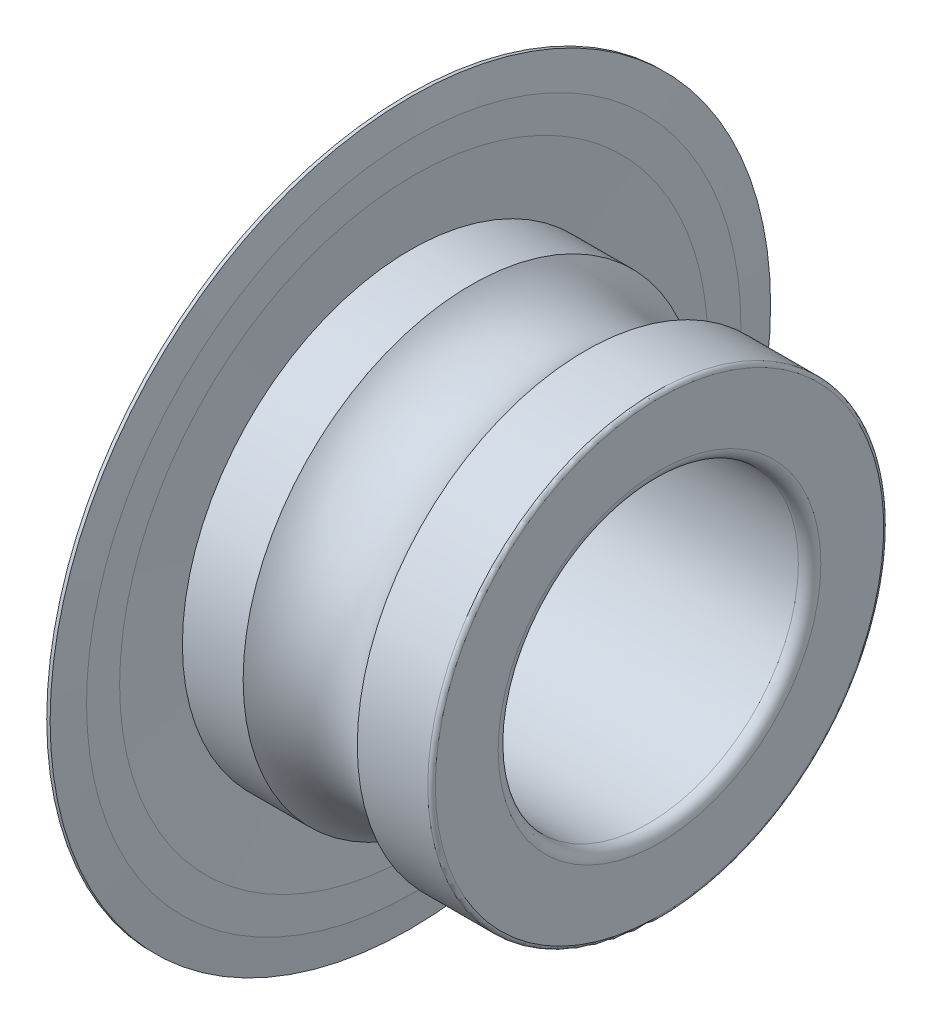
ISO-10303-21;
HEADER;
FILE_DESCRIPTION(('STEP AP214'),'2;1');
FILE_NAME('part.step','',(''),(''),'','','');
FILE_SCHEMA(('AUTOMOTIVE_DESIGN { 1 0 10303 214 1 1 1 1 }'));
ENDSEC;
DATA;
#1=APPLICATION_CONTEXT('core data for automotive mechanical design processes');
#2=APPLICATION_PROTOCOL_DEFINITION('international standard','automotive_design',2000,#1);
#3=PRODUCT_CONTEXT('',#1,'mechanical');
#4=PRODUCT('Part','Part','',(#3));
#5=PRODUCT_RELATED_PRODUCT_CATEGORY('part','',(#4));
#6=PRODUCT_DEFINITION_FORMATION('','',#4);
#7=PRODUCT_DEFINITION_CONTEXT('part definition',#1,'design');
#8=PRODUCT_DEFINITION('design','',#6,#7);
#9=PRODUCT_DEFINITION_SHAPE('','',#8);
#10=(LENGTH_UNIT() NAMED_UNIT(*) SI_UNIT(.MILLI.,.METRE.));
#11=(NAMED_UNIT(*) PLANE_ANGLE_UNIT() SI_UNIT($,.RADIAN.));
#12=(NAMED_UNIT(*) SI_UNIT($,.STERADIAN.) SOLID_ANGLE_UNIT());
#13=UNCERTAINTY_MEASURE_WITH_UNIT(LENGTH_MEASURE(1.E-05),#10,'distance_accuracy_value','');
#14=(GEOMETRIC_REPRESENTATION_CONTEXT(3) GLOBAL_UNCERTAINTY_ASSIGNED_CONTEXT((#13)) GLOBAL_UNIT_ASSIGNED_CONTEXT((#10,
#11,#12)) REPRESENTATION_CONTEXT('',''));
#15=CARTESIAN_POINT('',(0.,0.,0.));
#16=DIRECTION('',(0.,0.,1.));
#17=DIRECTION('',(1.,0.,0.));
#18=AXIS2_PLACEMENT_3D('',#15,#16,#17);
#19=CARTESIAN_POINT('',(50.,0.,0.));
#20=DIRECTION('',(-1.,0.,0.));
#21=DIRECTION('',(0.,0.,1.));
#22=AXIS2_PLACEMENT_3D('',#19,#20,#21);
#23=CYLINDRICAL_SURFACE('',#22,6.075);
#24=CARTESIAN_POINT('',(0.100000000000003,0.,0.));
#25=DIRECTION('',(-1.,0.,0.));
#26=DIRECTION('',(0.,0.,1.));
#27=AXIS2_PLACEMENT_3D('',#24,#25,#26);
#28=CIRCLE('',#27,6.075);
#29=CARTESIAN_POINT('',(0.100000000000003,0.,6.075));
#30=VERTEX_POINT('',#29);
#31=EDGE_CURVE('E76',#30,#30,#28,.T.);
#32=ORIENTED_EDGE('',*,*,#31,.F.);
#33=EDGE_LOOP('',(#32));
#34=FACE_BOUND('',#33,.T.);
#35=CARTESIAN_POINT('',(0.269999999999999,0.,0.));
#36=DIRECTION('',(1.,0.,0.));
#37=DIRECTION('',(0.,0.,-1.));
#38=AXIS2_PLACEMENT_3D('',#35,#36,#37);
#39=CIRCLE('',#38,6.075);
#40=CARTESIAN_POINT('',(0.269999999999999,0.,-6.075));
#41=VERTEX_POINT('',#40);
#42=EDGE_CURVE('E10',#41,#41,#39,.T.);
#43=ORIENTED_EDGE('',*,*,#42,.F.);
#44=EDGE_LOOP('',(#43));
#45=FACE_BOUND('',#44,.T.);
#46=ADVANCED_FACE('F35',(#34,#45),#23,.T.);
#47=CARTESIAN_POINT('',(1.979271473931,0.,0.));
#48=DIRECTION('',(-1.,0.,0.));
#49=DIRECTION('',(0.,0.,1.));
#50=AXIS2_PLACEMENT_3D('',#47,#48,#49);
#51=CIRCLE('',#50,6.075);
#52=CARTESIAN_POINT('',(1.979271473931,0.,6.075));
#53=VERTEX_POINT('',#52);
#54=EDGE_CURVE('E73',#53,#53,#51,.T.);
#55=ORIENTED_EDGE('',*,*,#54,.T.);
#56=EDGE_LOOP('',(#55));
#57=FACE_BOUND('',#56,.T.);
#58=CARTESIAN_POINT('',(0.359999999999999,0.,0.));
#59=DIRECTION('',(1.,0.,0.));
#60=DIRECTION('',(0.,0.,-1.));
#61=AXIS2_PLACEMENT_3D('',#58,#59,#60);
#62=CIRCLE('',#61,6.075);
#63=CARTESIAN_POINT('',(0.359999999999999,0.,-6.075));
#64=VERTEX_POINT('',#63);
#65=EDGE_CURVE('E42',#64,#64,#62,.F.);
#66=ORIENTED_EDGE('',*,*,#65,.F.);
#67=EDGE_LOOP('',(#66));
#68=FACE_BOUND('',#67,.T.);
#69=ADVANCED_FACE('F122',(#57,#68),#23,.T.);
#70=CARTESIAN_POINT('',(0.0999999999999221,0.,0.));
#71=DIRECTION('',(-1.,0.,0.));
#72=DIRECTION('',(0.,0.,1.));
#73=AXIS2_PLACEMENT_3D('',#70,#71,#72);
#74=TOROIDAL_SURFACE('',#73,5.97500000000008,0.0999999999999221);
#75=CARTESIAN_POINT('',(0.,0.,0.));
#76=DIRECTION('',(-1.,0.,0.));
#77=DIRECTION('',(0.,0.,1.));
#78=AXIS2_PLACEMENT_3D('',#75,#76,#77);
#79=CIRCLE('',#78,5.975);
#80=CARTESIAN_POINT('',(0.,0.,5.975));
#81=VERTEX_POINT('',#80);
#82=EDGE_CURVE('E46',#81,#81,#79,.T.);
#83=ORIENTED_EDGE('',*,*,#82,.F.);
#84=EDGE_LOOP('',(#83));
#85=FACE_BOUND('',#84,.T.);
#86=ORIENTED_EDGE('',*,*,#31,.T.);
#87=EDGE_LOOP('',(#86));
#88=FACE_BOUND('',#87,.T.);
#89=ADVANCED_FACE('F37',(#85,#88),#74,.T.);
#90=CARTESIAN_POINT('',(0.,5.975,0.));
#91=DIRECTION('',(1.,0.,0.));
#92=DIRECTION('',(0.,0.,-1.));
#93=AXIS2_PLACEMENT_3D('',#90,#91,#92);
#94=PLANE('',#93);
#95=CARTESIAN_POINT('',(0.,0.,0.));
#96=DIRECTION('',(-1.,0.,0.));
#97=DIRECTION('',(0.,0.,1.));
#98=AXIS2_PLACEMENT_3D('',#95,#96,#97);
#99=CIRCLE('',#98,4.3);
#100=CARTESIAN_POINT('',(0.,0.,4.3));
#101=VERTEX_POINT('',#100);
#102=EDGE_CURVE('E50',#101,#101,#99,.T.);
#103=ORIENTED_EDGE('',*,*,#102,.F.);
#104=EDGE_LOOP('',(#103));
#105=FACE_BOUND('',#104,.T.);
#106=ORIENTED_EDGE('',*,*,#82,.T.);
#107=EDGE_LOOP('',(#106));
#108=FACE_BOUND('',#107,.T.);
#109=ADVANCED_FACE('F160',(#105,#108),#94,.F.);
#110=CARTESIAN_POINT('',(0.299999999999939,0.,0.));
#111=DIRECTION('',(-1.,0.,0.));
#112=DIRECTION('',(0.,0.,1.));
#113=AXIS2_PLACEMENT_3D('',#110,#111,#112);
#114=TOROIDAL_SURFACE('',#113,4.29999999999994,0.299999999999939);
#115=CARTESIAN_POINT('',(0.300000000000002,0.,0.));
#116=DIRECTION('',(-1.,0.,0.));
#117=DIRECTION('',(0.,0.,1.));
#118=AXIS2_PLACEMENT_3D('',#115,#116,#117);
#119=CIRCLE('',#118,4.);
#120=CARTESIAN_POINT('',(0.300000000000002,0.,4.));
#121=VERTEX_POINT('',#120);
#122=EDGE_CURVE('E55',#121,#121,#119,.T.);
#123=ORIENTED_EDGE('',*,*,#122,.F.);
#124=EDGE_LOOP('',(#123));
#125=FACE_BOUND('',#124,.T.);
#126=ORIENTED_EDGE('',*,*,#102,.T.);
#127=EDGE_LOOP('',(#126));
#128=FACE_BOUND('',#127,.T.);
#129=ADVANCED_FACE('F157',(#125,#128),#114,.T.);
#130=CARTESIAN_POINT('',(50.,0.,0.));
#131=DIRECTION('',(-1.,0.,0.));
#132=DIRECTION('',(0.,0.,1.));
#133=AXIS2_PLACEMENT_3D('',#130,#131,#132);
#134=CYLINDRICAL_SURFACE('',#133,4.);
#135=CARTESIAN_POINT('',(6.7,0.,0.));
#136=DIRECTION('',(-1.,0.,0.));
#137=DIRECTION('',(0.,0.,1.));
#138=AXIS2_PLACEMENT_3D('',#135,#136,#137);
#139=CIRCLE('',#138,4.);
#140=CARTESIAN_POINT('',(6.7,0.,4.));
#141=VERTEX_POINT('',#140);
#142=EDGE_CURVE('E58',#141,#141,#139,.T.);
#143=ORIENTED_EDGE('',*,*,#142,.F.);
#144=EDGE_LOOP('',(#143));
#145=FACE_BOUND('',#144,.T.);
#146=ORIENTED_EDGE('',*,*,#122,.T.);
#147=EDGE_LOOP('',(#146));
#148=FACE_BOUND('',#147,.T.);
#149=ADVANCED_FACE('F153',(#145,#148),#134,.F.);
#150=CARTESIAN_POINT('',(6.70000000000012,0.,0.));
#151=DIRECTION('',(-1.,0.,0.));
#152=DIRECTION('',(0.,0.,1.));
#153=AXIS2_PLACEMENT_3D('',#150,#151,#152);
#154=TOROIDAL_SURFACE('',#153,4.29999999999988,0.299999999999878);
#155=CARTESIAN_POINT('',(7.,0.,0.));
#156=DIRECTION('',(-1.,0.,0.));
#157=DIRECTION('',(0.,0.,1.));
#158=AXIS2_PLACEMENT_3D('',#155,#156,#157);
#159=CIRCLE('',#158,4.29999999999988);
#160=CARTESIAN_POINT('',(7.,0.,4.29999999999988));
#161=VERTEX_POINT('',#160);
#162=EDGE_CURVE('E61',#161,#161,#159,.T.);
#163=ORIENTED_EDGE('',*,*,#162,.F.);
#164=EDGE_LOOP('',(#163));
#165=FACE_BOUND('',#164,.T.);
#166=ORIENTED_EDGE('',*,*,#142,.T.);
#167=EDGE_LOOP('',(#166));
#168=FACE_BOUND('',#167,.T.);
#169=ADVANCED_FACE('F149',(#165,#168),#154,.T.);
#170=CARTESIAN_POINT('',(7.,4.30000000000012,0.));
#171=DIRECTION('',(-1.,0.,0.));
#172=DIRECTION('',(0.,0.,1.));
#173=AXIS2_PLACEMENT_3D('',#170,#171,#172);
#174=PLANE('',#173);
#175=CARTESIAN_POINT('',(7.,0.,0.));
#176=DIRECTION('',(-1.,0.,0.));
#177=DIRECTION('',(0.,0.,1.));
#178=AXIS2_PLACEMENT_3D('',#175,#176,#177);
#179=CIRCLE('',#178,5.975);
#180=CARTESIAN_POINT('',(7.,0.,5.975));
#181=VERTEX_POINT('',#180);
#182=EDGE_CURVE('E64',#181,#181,#179,.T.);
#183=ORIENTED_EDGE('',*,*,#182,.F.);
#184=EDGE_LOOP('',(#183));
#185=FACE_BOUND('',#184,.T.);
#186=ORIENTED_EDGE('',*,*,#162,.T.);
#187=EDGE_LOOP('',(#186));
#188=FACE_BOUND('',#187,.T.);
#189=ADVANCED_FACE('F145',(#185,#188),#174,.F.);
#190=CARTESIAN_POINT('',(6.90000000000016,0.,0.));
#191=DIRECTION('',(-1.,0.,0.));
#192=DIRECTION('',(0.,0.,1.));
#193=AXIS2_PLACEMENT_3D('',#190,#191,#192);
#194=TOROIDAL_SURFACE('',#193,5.97500000000016,0.099999999999845);
#195=CARTESIAN_POINT('',(6.9,0.,0.));
#196=DIRECTION('',(-1.,0.,0.));
#197=DIRECTION('',(0.,0.,1.));
#198=AXIS2_PLACEMENT_3D('',#195,#196,#197);
#199=CIRCLE('',#198,6.075);
#200=CARTESIAN_POINT('',(6.9,0.,6.075));
#201=VERTEX_POINT('',#200);
#202=EDGE_CURVE('E67',#201,#201,#199,.T.);
#203=ORIENTED_EDGE('',*,*,#202,.F.);
#204=EDGE_LOOP('',(#203));
#205=FACE_BOUND('',#204,.T.);
#206=ORIENTED_EDGE('',*,*,#182,.T.);
#207=EDGE_LOOP('',(#206));
#208=FACE_BOUND('',#207,.T.);
#209=ADVANCED_FACE('F141',(#205,#208),#194,.T.);
#210=CARTESIAN_POINT('',(50.,0.,0.));
#211=DIRECTION('',(-1.,0.,0.));
#212=DIRECTION('',(0.,0.,1.));
#213=AXIS2_PLACEMENT_3D('',#210,#211,#212);
#214=CYLINDRICAL_SURFACE('',#213,6.075);
#215=CARTESIAN_POINT('',(5.020728526069,0.,0.));
#216=DIRECTION('',(-1.,0.,0.));
#217=DIRECTION('',(0.,0.,1.));
#218=AXIS2_PLACEMENT_3D('',#215,#216,#217);
#219=CIRCLE('',#218,6.075);
#220=CARTESIAN_POINT('',(5.020728526069,0.,6.075));
#221=VERTEX_POINT('',#220);
#222=EDGE_CURVE('E70',#221,#221,#219,.T.);
#223=ORIENTED_EDGE('',*,*,#222,.F.);
#224=EDGE_LOOP('',(#223));
#225=FACE_BOUND('',#224,.T.);
#226=ORIENTED_EDGE('',*,*,#202,.T.);
#227=EDGE_LOOP('',(#226));
#228=FACE_BOUND('',#227,.T.);
#229=ADVANCED_FACE('F137',(#225,#228),#214,.T.);
#230=CARTESIAN_POINT('',(3.5,0.,0.));
#231=DIRECTION('',(-1.,0.,0.));
#232=DIRECTION('',(0.,0.,1.));
#233=AXIS2_PLACEMENT_3D('',#230,#231,#232);
#234=TOROIDAL_SURFACE('',#233,7.34999999999999,1.98449999999999);
#235=ORIENTED_EDGE('',*,*,#54,.F.);
#236=EDGE_LOOP('',(#235));
#237=FACE_BOUND('',#236,.T.);
#238=ORIENTED_EDGE('',*,*,#222,.T.);
#239=EDGE_LOOP('',(#238));
#240=FACE_BOUND('',#239,.T.);
#241=ADVANCED_FACE('F134',(#237,#240),#234,.F.);
#242=CARTESIAN_POINT('',(50.,0.,0.));
#243=DIRECTION('',(-1.,0.,0.));
#244=DIRECTION('',(0.,0.,1.));
#245=AXIS2_PLACEMENT_3D('',#242,#243,#244);
#246=CYLINDRICAL_SURFACE('',#245,9.6);
#247=CARTESIAN_POINT('',(0.269999999999999,0.,0.));
#248=DIRECTION('',(-1.,0.,0.));
#249=DIRECTION('',(0.,0.,1.));
#250=AXIS2_PLACEMENT_3D('',#247,#248,#249);
#251=CIRCLE('',#250,9.6);
#252=CARTESIAN_POINT('',(0.269999999999999,0.,9.6));
#253=VERTEX_POINT('',#252);
#254=EDGE_CURVE('E79',#253,#253,#251,.T.);
#255=ORIENTED_EDGE('',*,*,#254,.F.);
#256=EDGE_LOOP('',(#255));
#257=FACE_BOUND('',#256,.T.);
#258=CARTESIAN_POINT('',(0.359999999999999,0.,0.));
#259=DIRECTION('',(-1.,0.,0.));
#260=DIRECTION('',(0.,0.,1.));
#261=AXIS2_PLACEMENT_3D('',#258,#259,#260);
#262=CIRCLE('',#261,9.6);
#263=CARTESIAN_POINT('',(0.359999999999999,0.,9.6));
#264=VERTEX_POINT('',#263);
#265=EDGE_CURVE('E94',#264,#264,#262,.T.);
#266=ORIENTED_EDGE('',*,*,#265,.T.);
#267=EDGE_LOOP('',(#266));
#268=FACE_BOUND('',#267,.T.);
#269=ADVANCED_FACE('F98',(#257,#268),#246,.T.);
#270=CARTESIAN_POINT('',(0.269999999999999,0.,0.));
#271=DIRECTION('',(-1.,0.,0.));
#272=DIRECTION('',(0.,0.,1.));
#273=AXIS2_PLACEMENT_3D('',#270,#271,#272);
#274=CONICAL_SURFACE('',#273,9.6,1.51977681092792);
#275=CARTESIAN_POINT('',(0.315000000000003,0.,0.));
#276=DIRECTION('',(-1.,0.,0.));
#277=DIRECTION('',(0.,0.,1.));
#278=AXIS2_PLACEMENT_3D('',#275,#276,#277);
#279=CIRCLE('',#278,8.71875);
#280=CARTESIAN_POINT('',(0.315000000000003,0.,8.71875));
#281=VERTEX_POINT('',#280);
#282=EDGE_CURVE('E82',#281,#281,#279,.T.);
#283=ORIENTED_EDGE('',*,*,#282,.F.);
#284=EDGE_LOOP('',(#283));
#285=FACE_BOUND('',#284,.T.);
#286=ORIENTED_EDGE('',*,*,#254,.T.);
#287=EDGE_LOOP('',(#286));
#288=FACE_BOUND('',#287,.T.);
#289=ADVANCED_FACE('F192',(#285,#288),#274,.F.);
#290=CARTESIAN_POINT('',(0.315000000000003,0.,0.));
#291=DIRECTION('',(1.,0.,0.));
#292=DIRECTION('',(0.,0.,-1.));
#293=AXIS2_PLACEMENT_3D('',#290,#291,#292);
#294=CONICAL_SURFACE('',#293,8.71875,1.51977681092792);
#295=CARTESIAN_POINT('',(0.269999999999999,0.,0.));
#296=DIRECTION('',(-1.,0.,0.));
#297=DIRECTION('',(0.,0.,1.));
#298=AXIS2_PLACEMENT_3D('',#295,#296,#297);
#299=CIRCLE('',#298,7.8375);
#300=CARTESIAN_POINT('',(0.269999999999999,0.,7.8375));
#301=VERTEX_POINT('',#300);
#302=EDGE_CURVE('E85',#301,#301,#299,.T.);
#303=ORIENTED_EDGE('',*,*,#302,.F.);
#304=EDGE_LOOP('',(#303));
#305=FACE_BOUND('',#304,.T.);
#306=ORIENTED_EDGE('',*,*,#282,.T.);
#307=EDGE_LOOP('',(#306));
#308=FACE_BOUND('',#307,.T.);
#309=ADVANCED_FACE('F119',(#305,#308),#294,.T.);
#310=CARTESIAN_POINT('',(0.27,7.8375,0.));
#311=DIRECTION('',(1.,0.,0.));
#312=DIRECTION('',(0.,0.,-1.));
#313=AXIS2_PLACEMENT_3D('',#310,#311,#312);
#314=PLANE('',#313);
#315=ORIENTED_EDGE('',*,*,#42,.T.);
#316=EDGE_LOOP('',(#315));
#317=FACE_BOUND('',#316,.T.);
#318=ORIENTED_EDGE('',*,*,#302,.T.);
#319=EDGE_LOOP('',(#318));
#320=FACE_BOUND('',#319,.T.);
#321=ADVANCED_FACE('F114',(#317,#320),#314,.F.);
#322=CARTESIAN_POINT('',(0.359999999999999,0.,0.));
#323=DIRECTION('',(1.,0.,0.));
#324=DIRECTION('',(0.,0.,-1.));
#325=AXIS2_PLACEMENT_3D('',#322,#323,#324);
#326=CONICAL_SURFACE('',#325,6.075,1.51977681092793);
#327=CARTESIAN_POINT('',(0.449999999999999,0.,0.));
#328=DIRECTION('',(-1.,0.,0.));
#329=DIRECTION('',(0.,0.,1.));
#330=AXIS2_PLACEMENT_3D('',#327,#328,#329);
#331=CIRCLE('',#330,7.8375);
#332=CARTESIAN_POINT('',(0.449999999999999,0.,7.8375));
#333=VERTEX_POINT('',#332);
#334=EDGE_CURVE('E88',#333,#333,#331,.T.);
#335=ORIENTED_EDGE('',*,*,#334,.F.);
#336=EDGE_LOOP('',(#335));
#337=FACE_BOUND('',#336,.T.);
#338=ORIENTED_EDGE('',*,*,#65,.T.);
#339=EDGE_LOOP('',(#338));
#340=FACE_BOUND('',#339,.T.);
#341=ADVANCED_FACE('F109',(#337,#340),#326,.F.);
#342=CARTESIAN_POINT('',(0.45,7.8375,0.));
#343=DIRECTION('',(-1.,0.,0.));
#344=DIRECTION('',(0.,0.,1.));
#345=AXIS2_PLACEMENT_3D('',#342,#343,#344);
#346=PLANE('',#345);
#347=CARTESIAN_POINT('',(0.449999999999999,0.,0.));
#348=DIRECTION('',(-1.,0.,0.));
#349=DIRECTION('',(0.,0.,1.));
#350=AXIS2_PLACEMENT_3D('',#347,#348,#349);
#351=CIRCLE('',#350,8.71875);
#352=CARTESIAN_POINT('',(0.449999999999999,0.,8.71875));
#353=VERTEX_POINT('',#352);
#354=EDGE_CURVE('E91',#353,#353,#351,.T.);
#355=ORIENTED_EDGE('',*,*,#354,.F.);
#356=EDGE_LOOP('',(#355));
#357=FACE_BOUND('',#356,.T.);
#358=ORIENTED_EDGE('',*,*,#334,.T.);
#359=EDGE_LOOP('',(#358));
#360=FACE_BOUND('',#359,.T.);
#361=ADVANCED_FACE('F103',(#357,#360),#346,.F.);
#362=CARTESIAN_POINT('',(0.449999999999999,0.,0.));
#363=DIRECTION('',(-1.,0.,0.));
#364=DIRECTION('',(0.,0.,1.));
#365=AXIS2_PLACEMENT_3D('',#362,#363,#364);
#366=CONICAL_SURFACE('',#365,8.71875,1.46902152746005);
#367=ORIENTED_EDGE('',*,*,#265,.F.);
#368=EDGE_LOOP('',(#367));
#369=FACE_BOUND('',#368,.T.);
#370=ORIENTED_EDGE('',*,*,#354,.T.);
#371=EDGE_LOOP('',(#370));
#372=FACE_BOUND('',#371,.T.);
#373=ADVANCED_FACE('F100',(#369,#372),#366,.T.);
#374=CLOSED_SHELL('',(#46,#69,#89,#109,#129,#149,#169,#189,#209,#229,#241,#269,#289,#309,#321,
#341,#361,#373));
#375=MANIFOLD_SOLID_BREP('B2',#374);
#376=ADVANCED_BREP_SHAPE_REPRESENTATION('',(#18,#375),#14);
#377=SHAPE_DEFINITION_REPRESENTATION(#9,#376);
ENDSEC;
END-ISO-10303-21;
